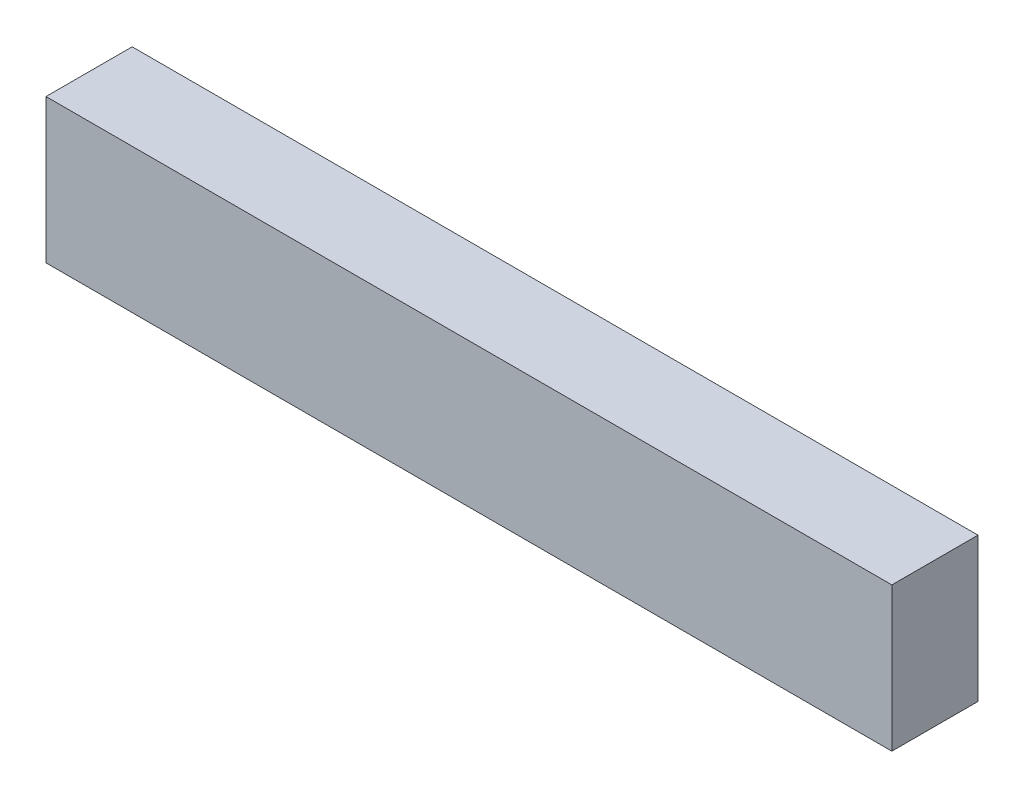
ISO-10303-21;
HEADER;
FILE_DESCRIPTION(('STEP AP214'),'2;1');
FILE_NAME('part.step','',(''),(''),'','','');
FILE_SCHEMA(('AUTOMOTIVE_DESIGN { 1 0 10303 214 1 1 1 1 }'));
ENDSEC;
DATA;
#1=APPLICATION_CONTEXT('core data for automotive mechanical design processes');
#2=APPLICATION_PROTOCOL_DEFINITION('international standard','automotive_design',2000,#1);
#3=PRODUCT_CONTEXT('',#1,'mechanical');
#4=PRODUCT('Part','Part','',(#3));
#5=PRODUCT_RELATED_PRODUCT_CATEGORY('part','',(#4));
#6=PRODUCT_DEFINITION_FORMATION('','',#4);
#7=PRODUCT_DEFINITION_CONTEXT('part definition',#1,'design');
#8=PRODUCT_DEFINITION('design','',#6,#7);
#9=PRODUCT_DEFINITION_SHAPE('','',#8);
#10=(LENGTH_UNIT() NAMED_UNIT(*) SI_UNIT(.MILLI.,.METRE.));
#11=(NAMED_UNIT(*) PLANE_ANGLE_UNIT() SI_UNIT($,.RADIAN.));
#12=(NAMED_UNIT(*) SI_UNIT($,.STERADIAN.) SOLID_ANGLE_UNIT());
#13=UNCERTAINTY_MEASURE_WITH_UNIT(LENGTH_MEASURE(1.E-05),#10,'distance_accuracy_value','');
#14=(GEOMETRIC_REPRESENTATION_CONTEXT(3) GLOBAL_UNCERTAINTY_ASSIGNED_CONTEXT((#13)) GLOBAL_UNIT_ASSIGNED_CONTEXT((#10,
#11,#12)) REPRESENTATION_CONTEXT('',''));
#15=CARTESIAN_POINT('',(0.,0.,0.));
#16=DIRECTION('',(0.,0.,1.));
#17=DIRECTION('',(1.,0.,0.));
#18=AXIS2_PLACEMENT_3D('',#15,#16,#17);
#19=CARTESIAN_POINT('',(-79.0368014902547,-65.45,7.25));
#20=DIRECTION('',(1.,0.,0.));
#21=DIRECTION('',(0.,0.,-1.));
#22=AXIS2_PLACEMENT_3D('',#19,#20,#21);
#23=PLANE('',#22);
#24=DIRECTION('',(0.,-1.,0.));
#25=VECTOR('',#24,1.);
#26=CARTESIAN_POINT('',(-79.0368014902547,-65.45,0.));
#27=LINE('',#26,#25);
#28=CARTESIAN_POINT('',(-79.0368014902547,-65.45,0.));
#29=VERTEX_POINT('',#28);
#30=CARTESIAN_POINT('',(-79.0368014902547,-77.5714301256037,0.));
#31=VERTEX_POINT('',#30);
#32=EDGE_CURVE('E128',#29,#31,#27,.T.);
#33=ORIENTED_EDGE('',*,*,#32,.T.);
#34=DIRECTION('',(0.,0.,-1.));
#35=VECTOR('',#34,1.);
#36=CARTESIAN_POINT('',(-79.0368014902547,-77.5714301256037,7.25));
#37=LINE('',#36,#35);
#38=CARTESIAN_POINT('',(-79.0368014902547,-77.5714301256037,7.25));
#39=VERTEX_POINT('',#38);
#40=EDGE_CURVE('E11',#39,#31,#37,.T.);
#41=ORIENTED_EDGE('',*,*,#40,.F.);
#42=DIRECTION('',(0.,-1.,0.));
#43=VECTOR('',#42,1.);
#44=CARTESIAN_POINT('',(-79.0368014902547,-65.45,7.25));
#45=LINE('',#44,#43);
#46=CARTESIAN_POINT('',(-79.0368014902547,-65.45,7.25));
#47=VERTEX_POINT('',#46);
#48=EDGE_CURVE('E148',#47,#39,#45,.T.);
#49=ORIENTED_EDGE('',*,*,#48,.F.);
#50=DIRECTION('',(0.,0.,-1.));
#51=VECTOR('',#50,1.);
#52=CARTESIAN_POINT('',(-79.0368014902547,-65.45,7.25));
#53=LINE('',#52,#51);
#54=EDGE_CURVE('E153',#47,#29,#53,.T.);
#55=ORIENTED_EDGE('',*,*,#54,.T.);
#56=EDGE_LOOP('',(#33,#41,#49,#55));
#57=FACE_BOUND('',#56,.T.);
#58=ADVANCED_FACE('F32',(#57),#23,.F.);
#59=CARTESIAN_POINT('',(-79.0368014902547,-77.5714301256037,7.25));
#60=DIRECTION('',(0.,1.,0.));
#61=DIRECTION('',(0.,0.,1.));
#62=AXIS2_PLACEMENT_3D('',#59,#60,#61);
#63=PLANE('',#62);
#64=DIRECTION('',(1.,0.,0.));
#65=VECTOR('',#64,1.);
#66=CARTESIAN_POINT('',(-79.0368014902547,-77.5714301256037,0.));
#67=LINE('',#66,#65);
#68=CARTESIAN_POINT('',(-7.85549999999964,-77.5714301256037,0.));
#69=VERTEX_POINT('',#68);
#70=EDGE_CURVE('E132',#31,#69,#67,.T.);
#71=ORIENTED_EDGE('',*,*,#70,.T.);
#72=DIRECTION('',(0.,0.,-1.));
#73=VECTOR('',#72,1.);
#74=CARTESIAN_POINT('',(-7.85549999999964,-77.5714301256037,7.25));
#75=LINE('',#74,#73);
#76=CARTESIAN_POINT('',(-7.85549999999964,-77.5714301256037,7.25));
#77=VERTEX_POINT('',#76);
#78=EDGE_CURVE('E39',#77,#69,#75,.T.);
#79=ORIENTED_EDGE('',*,*,#78,.F.);
#80=DIRECTION('',(1.,0.,0.));
#81=VECTOR('',#80,1.);
#82=CARTESIAN_POINT('',(-79.0368014902547,-77.5714301256037,7.25));
#83=LINE('',#82,#81);
#84=EDGE_CURVE('E83',#39,#77,#83,.T.);
#85=ORIENTED_EDGE('',*,*,#84,.F.);
#86=ORIENTED_EDGE('',*,*,#40,.T.);
#87=EDGE_LOOP('',(#71,#79,#85,#86));
#88=FACE_BOUND('',#87,.T.);
#89=ADVANCED_FACE('F182',(#88),#63,.F.);
#90=CARTESIAN_POINT('',(-7.85549999999964,-65.45,7.25));
#91=DIRECTION('',(-1.,0.,0.));
#92=DIRECTION('',(0.,0.,1.));
#93=AXIS2_PLACEMENT_3D('',#90,#91,#92);
#94=PLANE('',#93);
#95=DIRECTION('',(0.,1.,0.));
#96=VECTOR('',#95,1.);
#97=CARTESIAN_POINT('',(-7.85549999999964,-65.45,0.));
#98=LINE('',#97,#96);
#99=CARTESIAN_POINT('',(-7.85549999999964,-65.45,0.));
#100=VERTEX_POINT('',#99);
#101=EDGE_CURVE('E156',#69,#100,#98,.T.);
#102=ORIENTED_EDGE('',*,*,#101,.T.);
#103=DIRECTION('',(0.,0.,-1.));
#104=VECTOR('',#103,1.);
#105=CARTESIAN_POINT('',(-7.85549999999964,-65.45,7.25));
#106=LINE('',#105,#104);
#107=CARTESIAN_POINT('',(-7.85549999999964,-65.45,7.25));
#108=VERTEX_POINT('',#107);
#109=EDGE_CURVE('E160',#108,#100,#106,.T.);
#110=ORIENTED_EDGE('',*,*,#109,.F.);
#111=DIRECTION('',(0.,1.,0.));
#112=VECTOR('',#111,1.);
#113=CARTESIAN_POINT('',(-7.85549999999964,-65.45,7.25));
#114=LINE('',#113,#112);
#115=EDGE_CURVE('E151',#77,#108,#114,.T.);
#116=ORIENTED_EDGE('',*,*,#115,.F.);
#117=ORIENTED_EDGE('',*,*,#78,.T.);
#118=EDGE_LOOP('',(#102,#110,#116,#117));
#119=FACE_BOUND('',#118,.T.);
#120=ADVANCED_FACE('F165',(#119),#94,.F.);
#121=CARTESIAN_POINT('',(-79.0368014902547,-65.45,7.25));
#122=DIRECTION('',(0.,-1.,0.));
#123=DIRECTION('',(0.,0.,-1.));
#124=AXIS2_PLACEMENT_3D('',#121,#122,#123);
#125=PLANE('',#124);
#126=DIRECTION('',(-1.,0.,0.));
#127=VECTOR('',#126,1.);
#128=CARTESIAN_POINT('',(-79.0368014902547,-65.45,0.));
#129=LINE('',#128,#127);
#130=EDGE_CURVE('E76',#100,#29,#129,.T.);
#131=ORIENTED_EDGE('',*,*,#130,.T.);
#132=ORIENTED_EDGE('',*,*,#54,.F.);
#133=DIRECTION('',(-1.,0.,0.));
#134=VECTOR('',#133,1.);
#135=CARTESIAN_POINT('',(-79.0368014902547,-65.45,7.25));
#136=LINE('',#135,#134);
#137=EDGE_CURVE('E55',#108,#47,#136,.T.);
#138=ORIENTED_EDGE('',*,*,#137,.F.);
#139=ORIENTED_EDGE('',*,*,#109,.T.);
#140=EDGE_LOOP('',(#131,#132,#138,#139));
#141=FACE_BOUND('',#140,.T.);
#142=ADVANCED_FACE('F173',(#141),#125,.F.);
#143=CARTESIAN_POINT('',(0.,0.,7.25));
#144=DIRECTION('',(0.,0.,1.));
#145=DIRECTION('',(1.,0.,0.));
#146=AXIS2_PLACEMENT_3D('',#143,#144,#145);
#147=PLANE('',#146);
#148=ORIENTED_EDGE('',*,*,#48,.T.);
#149=ORIENTED_EDGE('',*,*,#84,.T.);
#150=ORIENTED_EDGE('',*,*,#115,.T.);
#151=ORIENTED_EDGE('',*,*,#137,.T.);
#152=EDGE_LOOP('',(#148,#149,#150,#151));
#153=FACE_BOUND('',#152,.T.);
#154=ADVANCED_FACE('F175',(#153),#147,.T.);
#155=CARTESIAN_POINT('',(0.,0.,0.));
#156=DIRECTION('',(0.,0.,1.));
#157=DIRECTION('',(1.,0.,0.));
#158=AXIS2_PLACEMENT_3D('',#155,#156,#157);
#159=PLANE('',#158);
#160=DIRECTION('',(-1.,0.,0.));
#161=VECTOR('',#160,1.);
#162=CARTESIAN_POINT('',(-79.0368014902547,-65.95,0.));
#163=LINE('',#162,#161);
#164=CARTESIAN_POINT('',(-8.35549999999964,-65.95,0.));
#165=VERTEX_POINT('',#164);
#166=CARTESIAN_POINT('',(-78.5368014902547,-65.95,0.));
#167=VERTEX_POINT('',#166);
#168=EDGE_CURVE('E123',#165,#167,#163,.T.);
#169=ORIENTED_EDGE('',*,*,#168,.T.);
#170=DIRECTION('',(0.,-1.,0.));
#171=VECTOR('',#170,1.);
#172=CARTESIAN_POINT('',(-78.5368014902547,-65.45,0.));
#173=LINE('',#172,#171);
#174=CARTESIAN_POINT('',(-78.5368014902547,-77.0714301256037,0.));
#175=VERTEX_POINT('',#174);
#176=EDGE_CURVE('E142',#167,#175,#173,.T.);
#177=ORIENTED_EDGE('',*,*,#176,.T.);
#178=DIRECTION('',(1.,0.,0.));
#179=VECTOR('',#178,1.);
#180=CARTESIAN_POINT('',(-79.0368014902547,-77.0714301256037,0.));
#181=LINE('',#180,#179);
#182=CARTESIAN_POINT('',(-8.35549999999964,-77.0714301256037,0.));
#183=VERTEX_POINT('',#182);
#184=EDGE_CURVE('E127',#175,#183,#181,.T.);
#185=ORIENTED_EDGE('',*,*,#184,.T.);
#186=DIRECTION('',(0.,1.,0.));
#187=VECTOR('',#186,1.);
#188=CARTESIAN_POINT('',(-8.35549999999964,-65.45,0.));
#189=LINE('',#188,#187);
#190=EDGE_CURVE('E46',#183,#165,#189,.T.);
#191=ORIENTED_EDGE('',*,*,#190,.T.);
#192=EDGE_LOOP('',(#169,#177,#185,#191));
#193=FACE_BOUND('',#192,.T.);
#194=ORIENTED_EDGE('',*,*,#32,.F.);
#195=ORIENTED_EDGE('',*,*,#130,.F.);
#196=ORIENTED_EDGE('',*,*,#101,.F.);
#197=ORIENTED_EDGE('',*,*,#70,.F.);
#198=EDGE_LOOP('',(#194,#195,#196,#197));
#199=FACE_BOUND('',#198,.T.);
#200=ADVANCED_FACE('F169',(#193,#199),#159,.F.);
#201=CARTESIAN_POINT('',(-78.5368014902547,-65.45,7.25));
#202=DIRECTION('',(1.,0.,0.));
#203=DIRECTION('',(0.,0.,-1.));
#204=AXIS2_PLACEMENT_3D('',#201,#202,#203);
#205=PLANE('',#204);
#206=ORIENTED_EDGE('',*,*,#176,.F.);
#207=DIRECTION('',(0.,0.,-1.));
#208=VECTOR('',#207,1.);
#209=CARTESIAN_POINT('',(-78.5368014902547,-65.95,7.25));
#210=LINE('',#209,#208);
#211=CARTESIAN_POINT('',(-78.5368014902547,-65.95,7.05));
#212=VERTEX_POINT('',#211);
#213=EDGE_CURVE('E122',#212,#167,#210,.T.);
#214=ORIENTED_EDGE('',*,*,#213,.F.);
#215=DIRECTION('',(0.,-1.,0.));
#216=VECTOR('',#215,1.);
#217=CARTESIAN_POINT('',(-78.5368014902547,-65.45,7.05));
#218=LINE('',#217,#216);
#219=CARTESIAN_POINT('',(-78.5368014902547,-77.0714301256037,7.05));
#220=VERTEX_POINT('',#219);
#221=EDGE_CURVE('E110',#212,#220,#218,.T.);
#222=ORIENTED_EDGE('',*,*,#221,.T.);
#223=DIRECTION('',(0.,0.,-1.));
#224=VECTOR('',#223,1.);
#225=CARTESIAN_POINT('',(-78.5368014902547,-77.0714301256037,7.25));
#226=LINE('',#225,#224);
#227=EDGE_CURVE('E120',#220,#175,#226,.T.);
#228=ORIENTED_EDGE('',*,*,#227,.T.);
#229=EDGE_LOOP('',(#206,#214,#222,#228));
#230=FACE_BOUND('',#229,.T.);
#231=ADVANCED_FACE('F119',(#230),#205,.T.);
#232=CARTESIAN_POINT('',(-79.0368014902547,-77.0714301256037,7.25));
#233=DIRECTION('',(0.,1.,0.));
#234=DIRECTION('',(0.,0.,1.));
#235=AXIS2_PLACEMENT_3D('',#232,#233,#234);
#236=PLANE('',#235);
#237=ORIENTED_EDGE('',*,*,#184,.F.);
#238=ORIENTED_EDGE('',*,*,#227,.F.);
#239=DIRECTION('',(1.,0.,0.));
#240=VECTOR('',#239,1.);
#241=CARTESIAN_POINT('',(-79.0368014902547,-77.0714301256037,7.05));
#242=LINE('',#241,#240);
#243=CARTESIAN_POINT('',(-8.35549999999964,-77.0714301256037,7.05));
#244=VERTEX_POINT('',#243);
#245=EDGE_CURVE('E106',#220,#244,#242,.T.);
#246=ORIENTED_EDGE('',*,*,#245,.T.);
#247=DIRECTION('',(0.,0.,-1.));
#248=VECTOR('',#247,1.);
#249=CARTESIAN_POINT('',(-8.35549999999964,-77.0714301256037,7.25));
#250=LINE('',#249,#248);
#251=EDGE_CURVE('E129',#244,#183,#250,.T.);
#252=ORIENTED_EDGE('',*,*,#251,.T.);
#253=EDGE_LOOP('',(#237,#238,#246,#252));
#254=FACE_BOUND('',#253,.T.);
#255=ADVANCED_FACE('F125',(#254),#236,.T.);
#256=CARTESIAN_POINT('',(-8.35549999999964,-65.45,7.25));
#257=DIRECTION('',(-1.,0.,0.));
#258=DIRECTION('',(0.,0.,1.));
#259=AXIS2_PLACEMENT_3D('',#256,#257,#258);
#260=PLANE('',#259);
#261=ORIENTED_EDGE('',*,*,#190,.F.);
#262=ORIENTED_EDGE('',*,*,#251,.F.);
#263=DIRECTION('',(0.,1.,0.));
#264=VECTOR('',#263,1.);
#265=CARTESIAN_POINT('',(-8.35549999999964,-65.45,7.05));
#266=LINE('',#265,#264);
#267=CARTESIAN_POINT('',(-8.35549999999964,-65.95,7.05));
#268=VERTEX_POINT('',#267);
#269=EDGE_CURVE('E111',#244,#268,#266,.T.);
#270=ORIENTED_EDGE('',*,*,#269,.T.);
#271=DIRECTION('',(0.,0.,-1.));
#272=VECTOR('',#271,1.);
#273=CARTESIAN_POINT('',(-8.35549999999965,-65.95,7.25));
#274=LINE('',#273,#272);
#275=EDGE_CURVE('E134',#268,#165,#274,.T.);
#276=ORIENTED_EDGE('',*,*,#275,.T.);
#277=EDGE_LOOP('',(#261,#262,#270,#276));
#278=FACE_BOUND('',#277,.T.);
#279=ADVANCED_FACE('F230',(#278),#260,.T.);
#280=CARTESIAN_POINT('',(-79.0368014902547,-65.95,7.25));
#281=DIRECTION('',(0.,-1.,0.));
#282=DIRECTION('',(0.,0.,-1.));
#283=AXIS2_PLACEMENT_3D('',#280,#281,#282);
#284=PLANE('',#283);
#285=ORIENTED_EDGE('',*,*,#168,.F.);
#286=ORIENTED_EDGE('',*,*,#275,.F.);
#287=DIRECTION('',(-1.,0.,0.));
#288=VECTOR('',#287,1.);
#289=CARTESIAN_POINT('',(-79.0368014902547,-65.95,7.05));
#290=LINE('',#289,#288);
#291=EDGE_CURVE('E137',#268,#212,#290,.T.);
#292=ORIENTED_EDGE('',*,*,#291,.T.);
#293=ORIENTED_EDGE('',*,*,#213,.T.);
#294=EDGE_LOOP('',(#285,#286,#292,#293));
#295=FACE_BOUND('',#294,.T.);
#296=ADVANCED_FACE('F239',(#295),#284,.T.);
#297=CARTESIAN_POINT('',(0.,0.,7.05));
#298=DIRECTION('',(0.,0.,1.));
#299=DIRECTION('',(1.,0.,0.));
#300=AXIS2_PLACEMENT_3D('',#297,#298,#299);
#301=PLANE('',#300);
#302=ORIENTED_EDGE('',*,*,#221,.F.);
#303=ORIENTED_EDGE('',*,*,#291,.F.);
#304=ORIENTED_EDGE('',*,*,#269,.F.);
#305=ORIENTED_EDGE('',*,*,#245,.F.);
#306=EDGE_LOOP('',(#302,#303,#304,#305));
#307=FACE_BOUND('',#306,.T.);
#308=ADVANCED_FACE('F108',(#307),#301,.F.);
#309=CLOSED_SHELL('',(#58,#89,#120,#142,#154,#200,#231,#255,#279,#296,#308));
#310=MANIFOLD_SOLID_BREP('B2',#309);
#311=ADVANCED_BREP_SHAPE_REPRESENTATION('',(#18,#310),#14);
#312=SHAPE_DEFINITION_REPRESENTATION(#9,#311);
ENDSEC;
END-ISO-10303-21;
